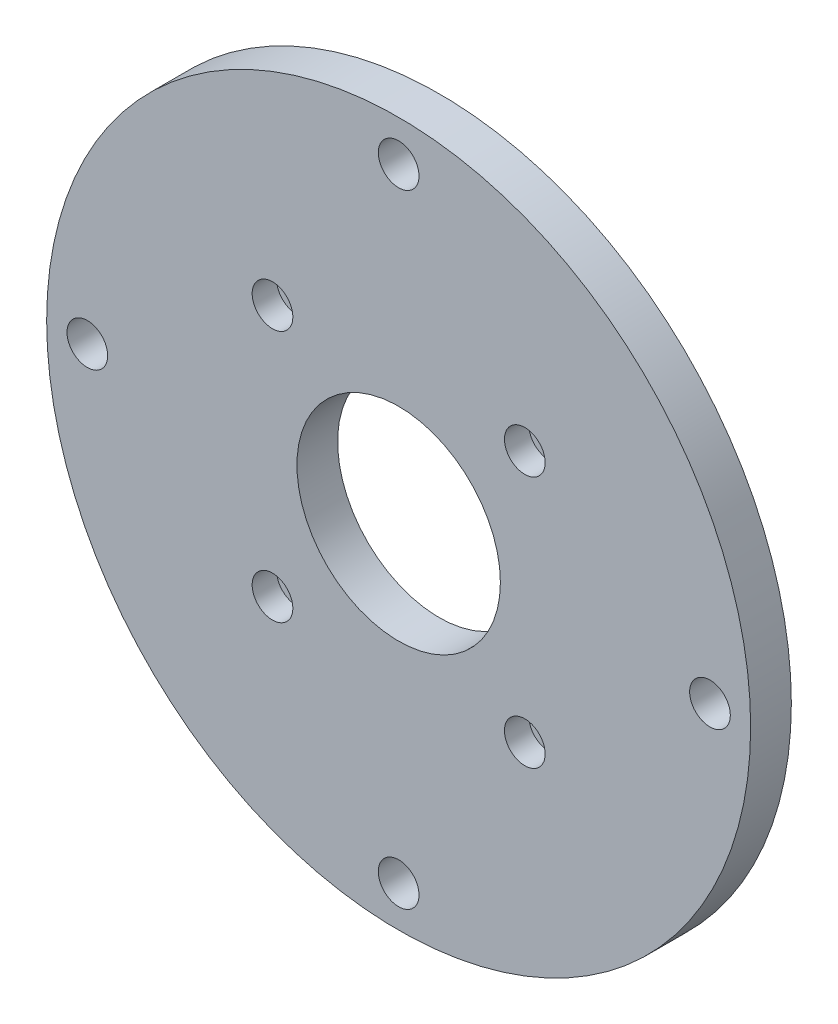
ISO-10303-21;
HEADER;
FILE_DESCRIPTION(('STEP AP214'),'2;1');
FILE_NAME('part.step','',(''),(''),'','','');
FILE_SCHEMA(('AUTOMOTIVE_DESIGN { 1 0 10303 214 1 1 1 1 }'));
ENDSEC;
DATA;
#1=APPLICATION_CONTEXT('core data for automotive mechanical design processes');
#2=APPLICATION_PROTOCOL_DEFINITION('international standard','automotive_design',2000,#1);
#3=PRODUCT_CONTEXT('',#1,'mechanical');
#4=PRODUCT('Part','Part','',(#3));
#5=PRODUCT_RELATED_PRODUCT_CATEGORY('part','',(#4));
#6=PRODUCT_DEFINITION_FORMATION('','',#4);
#7=PRODUCT_DEFINITION_CONTEXT('part definition',#1,'design');
#8=PRODUCT_DEFINITION('design','',#6,#7);
#9=PRODUCT_DEFINITION_SHAPE('','',#8);
#10=(LENGTH_UNIT() NAMED_UNIT(*) SI_UNIT(.MILLI.,.METRE.));
#11=(NAMED_UNIT(*) PLANE_ANGLE_UNIT() SI_UNIT($,.RADIAN.));
#12=(NAMED_UNIT(*) SI_UNIT($,.STERADIAN.) SOLID_ANGLE_UNIT());
#13=UNCERTAINTY_MEASURE_WITH_UNIT(LENGTH_MEASURE(1.E-05),#10,'distance_accuracy_value','');
#14=(GEOMETRIC_REPRESENTATION_CONTEXT(3) GLOBAL_UNCERTAINTY_ASSIGNED_CONTEXT((#13)) GLOBAL_UNIT_ASSIGNED_CONTEXT((#10,
#11,#12)) REPRESENTATION_CONTEXT('',''));
#15=CARTESIAN_POINT('',(0.,0.,0.));
#16=DIRECTION('',(0.,0.,1.));
#17=DIRECTION('',(1.,0.,0.));
#18=AXIS2_PLACEMENT_3D('',#15,#16,#17);
#19=CARTESIAN_POINT('',(-15.5,15.5,5.));
#20=DIRECTION('',(0.,0.,-1.));
#21=DIRECTION('',(-1.,0.,0.));
#22=AXIS2_PLACEMENT_3D('',#19,#20,#21);
#23=CYLINDRICAL_SURFACE('',#22,1.75);
#24=CARTESIAN_POINT('',(-15.5,15.5,0.));
#25=DIRECTION('',(0.,0.,1.));
#26=DIRECTION('',(1.,0.,0.));
#27=AXIS2_PLACEMENT_3D('',#24,#25,#26);
#28=CIRCLE('',#27,1.75);
#29=CARTESIAN_POINT('',(-13.75,15.5,0.));
#30=VERTEX_POINT('',#29);
#31=EDGE_CURVE('E44',#30,#30,#28,.T.);
#32=ORIENTED_EDGE('',*,*,#31,.F.);
#33=EDGE_LOOP('',(#32));
#34=FACE_BOUND('',#33,.T.);
#35=CARTESIAN_POINT('',(-15.5,15.5,2.));
#36=DIRECTION('',(0.,0.,1.));
#37=DIRECTION('',(1.,0.,0.));
#38=AXIS2_PLACEMENT_3D('',#35,#36,#37);
#39=CIRCLE('',#38,1.75);
#40=CARTESIAN_POINT('',(-13.75,15.5,2.));
#41=VERTEX_POINT('',#40);
#42=EDGE_CURVE('E35',#41,#41,#39,.T.);
#43=ORIENTED_EDGE('',*,*,#42,.T.);
#44=EDGE_LOOP('',(#43));
#45=FACE_BOUND('',#44,.T.);
#46=ADVANCED_FACE('F31',(#34,#45),#23,.F.);
#47=CARTESIAN_POINT('',(15.5,15.5,5.));
#48=DIRECTION('',(0.,0.,-1.));
#49=DIRECTION('',(-1.,0.,0.));
#50=AXIS2_PLACEMENT_3D('',#47,#48,#49);
#51=CYLINDRICAL_SURFACE('',#50,1.75);
#52=CARTESIAN_POINT('',(15.5,15.5,0.));
#53=DIRECTION('',(0.,0.,1.));
#54=DIRECTION('',(1.,0.,0.));
#55=AXIS2_PLACEMENT_3D('',#52,#53,#54);
#56=CIRCLE('',#55,1.75);
#57=CARTESIAN_POINT('',(17.25,15.5,0.));
#58=VERTEX_POINT('',#57);
#59=EDGE_CURVE('E78',#58,#58,#56,.T.);
#60=ORIENTED_EDGE('',*,*,#59,.F.);
#61=EDGE_LOOP('',(#60));
#62=FACE_BOUND('',#61,.T.);
#63=CARTESIAN_POINT('',(15.5,15.5,2.));
#64=DIRECTION('',(0.,0.,1.));
#65=DIRECTION('',(1.,0.,0.));
#66=AXIS2_PLACEMENT_3D('',#63,#64,#65);
#67=CIRCLE('',#66,1.75);
#68=CARTESIAN_POINT('',(17.25,15.5,2.));
#69=VERTEX_POINT('',#68);
#70=EDGE_CURVE('E55',#69,#69,#67,.T.);
#71=ORIENTED_EDGE('',*,*,#70,.T.);
#72=EDGE_LOOP('',(#71));
#73=FACE_BOUND('',#72,.T.);
#74=ADVANCED_FACE('F123',(#62,#73),#51,.F.);
#75=CARTESIAN_POINT('',(15.5,-15.5,5.));
#76=DIRECTION('',(0.,0.,-1.));
#77=DIRECTION('',(-1.,0.,0.));
#78=AXIS2_PLACEMENT_3D('',#75,#76,#77);
#79=CYLINDRICAL_SURFACE('',#78,1.75);
#80=CARTESIAN_POINT('',(15.5,-15.5,0.));
#81=DIRECTION('',(0.,0.,1.));
#82=DIRECTION('',(1.,0.,0.));
#83=AXIS2_PLACEMENT_3D('',#80,#81,#82);
#84=CIRCLE('',#83,1.75);
#85=CARTESIAN_POINT('',(17.25,-15.5,0.));
#86=VERTEX_POINT('',#85);
#87=EDGE_CURVE('E75',#86,#86,#84,.T.);
#88=ORIENTED_EDGE('',*,*,#87,.F.);
#89=EDGE_LOOP('',(#88));
#90=FACE_BOUND('',#89,.T.);
#91=CARTESIAN_POINT('',(15.5,-15.5,2.));
#92=DIRECTION('',(0.,0.,1.));
#93=DIRECTION('',(1.,0.,0.));
#94=AXIS2_PLACEMENT_3D('',#91,#92,#93);
#95=CIRCLE('',#94,1.75);
#96=CARTESIAN_POINT('',(17.25,-15.5,2.));
#97=VERTEX_POINT('',#96);
#98=EDGE_CURVE('E52',#97,#97,#95,.T.);
#99=ORIENTED_EDGE('',*,*,#98,.T.);
#100=EDGE_LOOP('',(#99));
#101=FACE_BOUND('',#100,.T.);
#102=ADVANCED_FACE('F128',(#90,#101),#79,.F.);
#103=CARTESIAN_POINT('',(-15.5,-15.5,5.));
#104=DIRECTION('',(0.,0.,-1.));
#105=DIRECTION('',(-1.,0.,0.));
#106=AXIS2_PLACEMENT_3D('',#103,#104,#105);
#107=CYLINDRICAL_SURFACE('',#106,1.75);
#108=CARTESIAN_POINT('',(-15.5,-15.5,0.));
#109=DIRECTION('',(0.,0.,1.));
#110=DIRECTION('',(1.,0.,0.));
#111=AXIS2_PLACEMENT_3D('',#108,#109,#110);
#112=CIRCLE('',#111,1.75);
#113=CARTESIAN_POINT('',(-13.75,-15.5,0.));
#114=VERTEX_POINT('',#113);
#115=EDGE_CURVE('E69',#114,#114,#112,.T.);
#116=ORIENTED_EDGE('',*,*,#115,.F.);
#117=EDGE_LOOP('',(#116));
#118=FACE_BOUND('',#117,.T.);
#119=CARTESIAN_POINT('',(-15.5,-15.5,2.));
#120=DIRECTION('',(0.,0.,1.));
#121=DIRECTION('',(1.,0.,0.));
#122=AXIS2_PLACEMENT_3D('',#119,#120,#121);
#123=CIRCLE('',#122,1.75);
#124=CARTESIAN_POINT('',(-13.75,-15.5,2.));
#125=VERTEX_POINT('',#124);
#126=EDGE_CURVE('E49',#125,#125,#123,.T.);
#127=ORIENTED_EDGE('',*,*,#126,.T.);
#128=EDGE_LOOP('',(#127));
#129=FACE_BOUND('',#128,.T.);
#130=ADVANCED_FACE('F135',(#118,#129),#107,.F.);
#131=CARTESIAN_POINT('',(0.,0.,5.));
#132=DIRECTION('',(0.,0.,1.));
#133=DIRECTION('',(1.,0.,0.));
#134=AXIS2_PLACEMENT_3D('',#131,#132,#133);
#135=PLANE('',#134);
#136=CARTESIAN_POINT('',(-15.5,-15.5,5.));
#137=DIRECTION('',(0.,0.,1.));
#138=DIRECTION('',(1.,0.,0.));
#139=AXIS2_PLACEMENT_3D('',#136,#137,#138);
#140=CIRCLE('',#139,2.5);
#141=CARTESIAN_POINT('',(-13.,-15.5,5.));
#142=VERTEX_POINT('',#141);
#143=EDGE_CURVE('E314',#142,#142,#140,.T.);
#144=ORIENTED_EDGE('',*,*,#143,.F.);
#145=EDGE_LOOP('',(#144));
#146=FACE_BOUND('',#145,.T.);
#147=CARTESIAN_POINT('',(15.5,-15.5,5.));
#148=DIRECTION('',(0.,0.,1.));
#149=DIRECTION('',(1.,0.,0.));
#150=AXIS2_PLACEMENT_3D('',#147,#148,#149);
#151=CIRCLE('',#150,2.5);
#152=CARTESIAN_POINT('',(18.,-15.5,5.));
#153=VERTEX_POINT('',#152);
#154=EDGE_CURVE('E320',#153,#153,#151,.T.);
#155=ORIENTED_EDGE('',*,*,#154,.F.);
#156=EDGE_LOOP('',(#155));
#157=FACE_BOUND('',#156,.T.);
#158=CARTESIAN_POINT('',(15.5,15.5,5.));
#159=DIRECTION('',(0.,0.,1.));
#160=DIRECTION('',(1.,0.,0.));
#161=AXIS2_PLACEMENT_3D('',#158,#159,#160);
#162=CIRCLE('',#161,2.5);
#163=CARTESIAN_POINT('',(18.,15.5,5.));
#164=VERTEX_POINT('',#163);
#165=EDGE_CURVE('E326',#164,#164,#162,.T.);
#166=ORIENTED_EDGE('',*,*,#165,.F.);
#167=EDGE_LOOP('',(#166));
#168=FACE_BOUND('',#167,.T.);
#169=CARTESIAN_POINT('',(-15.5,15.5,5.));
#170=DIRECTION('',(0.,0.,1.));
#171=DIRECTION('',(1.,0.,0.));
#172=AXIS2_PLACEMENT_3D('',#169,#170,#171);
#173=CIRCLE('',#172,2.5);
#174=CARTESIAN_POINT('',(-13.,15.5,5.));
#175=VERTEX_POINT('',#174);
#176=EDGE_CURVE('E309',#175,#175,#173,.T.);
#177=ORIENTED_EDGE('',*,*,#176,.F.);
#178=EDGE_LOOP('',(#177));
#179=FACE_BOUND('',#178,.T.);
#180=CARTESIAN_POINT('',(0.,-38.25,5.));
#181=DIRECTION('',(0.,0.,1.));
#182=DIRECTION('',(1.,0.,0.));
#183=AXIS2_PLACEMENT_3D('',#180,#181,#182);
#184=CIRCLE('',#183,2.5);
#185=CARTESIAN_POINT('',(2.5,-38.25,5.));
#186=VERTEX_POINT('',#185);
#187=EDGE_CURVE('E88',#186,#186,#184,.T.);
#188=ORIENTED_EDGE('',*,*,#187,.F.);
#189=EDGE_LOOP('',(#188));
#190=FACE_BOUND('',#189,.T.);
#191=CARTESIAN_POINT('',(0.,38.25,5.));
#192=DIRECTION('',(0.,0.,1.));
#193=DIRECTION('',(1.,0.,0.));
#194=AXIS2_PLACEMENT_3D('',#191,#192,#193);
#195=CIRCLE('',#194,2.5);
#196=CARTESIAN_POINT('',(2.5,38.25,5.));
#197=VERTEX_POINT('',#196);
#198=EDGE_CURVE('E100',#197,#197,#195,.T.);
#199=ORIENTED_EDGE('',*,*,#198,.F.);
#200=EDGE_LOOP('',(#199));
#201=FACE_BOUND('',#200,.T.);
#202=CARTESIAN_POINT('',(0.,0.,5.));
#203=DIRECTION('',(0.,0.,1.));
#204=DIRECTION('',(1.,0.,0.));
#205=AXIS2_PLACEMENT_3D('',#202,#203,#204);
#206=CIRCLE('',#205,43.25);
#207=CARTESIAN_POINT('',(43.25,0.,5.));
#208=VERTEX_POINT('',#207);
#209=EDGE_CURVE('E10',#208,#208,#206,.T.);
#210=ORIENTED_EDGE('',*,*,#209,.T.);
#211=EDGE_LOOP('',(#210));
#212=FACE_BOUND('',#211,.T.);
#213=CARTESIAN_POINT('',(38.25,0.,5.));
#214=DIRECTION('',(0.,0.,1.));
#215=DIRECTION('',(1.,0.,0.));
#216=AXIS2_PLACEMENT_3D('',#213,#214,#215);
#217=CIRCLE('',#216,2.5);
#218=CARTESIAN_POINT('',(40.75,0.,5.));
#219=VERTEX_POINT('',#218);
#220=EDGE_CURVE('E94',#219,#219,#217,.T.);
#221=ORIENTED_EDGE('',*,*,#220,.F.);
#222=EDGE_LOOP('',(#221));
#223=FACE_BOUND('',#222,.T.);
#224=CARTESIAN_POINT('',(-38.25,0.,5.));
#225=DIRECTION('',(0.,0.,1.));
#226=DIRECTION('',(1.,0.,0.));
#227=AXIS2_PLACEMENT_3D('',#224,#225,#226);
#228=CIRCLE('',#227,2.5);
#229=CARTESIAN_POINT('',(-35.75,0.,5.));
#230=VERTEX_POINT('',#229);
#231=EDGE_CURVE('E82',#230,#230,#228,.T.);
#232=ORIENTED_EDGE('',*,*,#231,.F.);
#233=EDGE_LOOP('',(#232));
#234=FACE_BOUND('',#233,.T.);
#235=CARTESIAN_POINT('',(0.,0.,5.));
#236=DIRECTION('',(0.,0.,1.));
#237=DIRECTION('',(1.,0.,0.));
#238=AXIS2_PLACEMENT_3D('',#235,#236,#237);
#239=CIRCLE('',#238,12.5);
#240=CARTESIAN_POINT('',(12.5,0.,5.));
#241=VERTEX_POINT('',#240);
#242=EDGE_CURVE('E64',#241,#241,#239,.T.);
#243=ORIENTED_EDGE('',*,*,#242,.F.);
#244=EDGE_LOOP('',(#243));
#245=FACE_BOUND('',#244,.T.);
#246=ADVANCED_FACE('F133',(#146,#157,#168,#179,#190,#201,#212,#223,#234,#245),#135,.T.);
#247=CARTESIAN_POINT('',(0.,0.,0.));
#248=DIRECTION('',(0.,0.,1.));
#249=DIRECTION('',(1.,0.,0.));
#250=AXIS2_PLACEMENT_3D('',#247,#248,#249);
#251=PLANE('',#250);
#252=CARTESIAN_POINT('',(0.,0.,0.));
#253=DIRECTION('',(0.,0.,1.));
#254=DIRECTION('',(1.,0.,0.));
#255=AXIS2_PLACEMENT_3D('',#252,#253,#254);
#256=CIRCLE('',#255,43.25);
#257=CARTESIAN_POINT('',(43.25,0.,0.));
#258=VERTEX_POINT('',#257);
#259=EDGE_CURVE('E39',#258,#258,#256,.T.);
#260=ORIENTED_EDGE('',*,*,#259,.F.);
#261=EDGE_LOOP('',(#260));
#262=FACE_BOUND('',#261,.T.);
#263=ORIENTED_EDGE('',*,*,#31,.T.);
#264=EDGE_LOOP('',(#263));
#265=FACE_BOUND('',#264,.T.);
#266=CARTESIAN_POINT('',(0.,38.25,0.));
#267=DIRECTION('',(0.,0.,1.));
#268=DIRECTION('',(1.,0.,0.));
#269=AXIS2_PLACEMENT_3D('',#266,#267,#268);
#270=CIRCLE('',#269,2.5);
#271=CARTESIAN_POINT('',(2.5,38.25,0.));
#272=VERTEX_POINT('',#271);
#273=EDGE_CURVE('E97',#272,#272,#270,.T.);
#274=ORIENTED_EDGE('',*,*,#273,.T.);
#275=EDGE_LOOP('',(#274));
#276=FACE_BOUND('',#275,.T.);
#277=CARTESIAN_POINT('',(38.25,0.,0.));
#278=DIRECTION('',(0.,0.,1.));
#279=DIRECTION('',(1.,0.,0.));
#280=AXIS2_PLACEMENT_3D('',#277,#278,#279);
#281=CIRCLE('',#280,2.5);
#282=CARTESIAN_POINT('',(40.75,0.,0.));
#283=VERTEX_POINT('',#282);
#284=EDGE_CURVE('E91',#283,#283,#281,.T.);
#285=ORIENTED_EDGE('',*,*,#284,.T.);
#286=EDGE_LOOP('',(#285));
#287=FACE_BOUND('',#286,.T.);
#288=CARTESIAN_POINT('',(0.,-38.25,0.));
#289=DIRECTION('',(0.,0.,1.));
#290=DIRECTION('',(1.,0.,0.));
#291=AXIS2_PLACEMENT_3D('',#288,#289,#290);
#292=CIRCLE('',#291,2.5);
#293=CARTESIAN_POINT('',(2.5,-38.25,0.));
#294=VERTEX_POINT('',#293);
#295=EDGE_CURVE('E85',#294,#294,#292,.T.);
#296=ORIENTED_EDGE('',*,*,#295,.T.);
#297=EDGE_LOOP('',(#296));
#298=FACE_BOUND('',#297,.T.);
#299=CARTESIAN_POINT('',(-38.25,0.,0.));
#300=DIRECTION('',(0.,0.,1.));
#301=DIRECTION('',(1.,0.,0.));
#302=AXIS2_PLACEMENT_3D('',#299,#300,#301);
#303=CIRCLE('',#302,2.5);
#304=CARTESIAN_POINT('',(-35.75,0.,0.));
#305=VERTEX_POINT('',#304);
#306=EDGE_CURVE('E81',#305,#305,#303,.T.);
#307=ORIENTED_EDGE('',*,*,#306,.T.);
#308=EDGE_LOOP('',(#307));
#309=FACE_BOUND('',#308,.T.);
#310=ORIENTED_EDGE('',*,*,#59,.T.);
#311=EDGE_LOOP('',(#310));
#312=FACE_BOUND('',#311,.T.);
#313=ORIENTED_EDGE('',*,*,#87,.T.);
#314=EDGE_LOOP('',(#313));
#315=FACE_BOUND('',#314,.T.);
#316=ORIENTED_EDGE('',*,*,#115,.T.);
#317=EDGE_LOOP('',(#316));
#318=FACE_BOUND('',#317,.T.);
#319=CARTESIAN_POINT('',(0.,0.,0.));
#320=DIRECTION('',(0.,0.,1.));
#321=DIRECTION('',(1.,0.,0.));
#322=AXIS2_PLACEMENT_3D('',#319,#320,#321);
#323=CIRCLE('',#322,12.5);
#324=CARTESIAN_POINT('',(12.5,0.,0.));
#325=VERTEX_POINT('',#324);
#326=EDGE_CURVE('E60',#325,#325,#323,.T.);
#327=ORIENTED_EDGE('',*,*,#326,.T.);
#328=EDGE_LOOP('',(#327));
#329=FACE_BOUND('',#328,.T.);
#330=ADVANCED_FACE('F105',(#262,#265,#276,#287,#298,#309,#312,#315,#318,#329),#251,.F.);
#331=CARTESIAN_POINT('',(0.,0.,5.));
#332=DIRECTION('',(0.,0.,-1.));
#333=DIRECTION('',(-1.,0.,0.));
#334=AXIS2_PLACEMENT_3D('',#331,#332,#333);
#335=CYLINDRICAL_SURFACE('',#334,43.25);
#336=ORIENTED_EDGE('',*,*,#209,.F.);
#337=EDGE_LOOP('',(#336));
#338=FACE_BOUND('',#337,.T.);
#339=ORIENTED_EDGE('',*,*,#259,.T.);
#340=EDGE_LOOP('',(#339));
#341=FACE_BOUND('',#340,.T.);
#342=ADVANCED_FACE('F33',(#338,#341),#335,.T.);
#343=CARTESIAN_POINT('',(0.,38.25,5.));
#344=DIRECTION('',(0.,0.,-1.));
#345=DIRECTION('',(-1.,0.,0.));
#346=AXIS2_PLACEMENT_3D('',#343,#344,#345);
#347=CYLINDRICAL_SURFACE('',#346,2.5);
#348=ORIENTED_EDGE('',*,*,#198,.T.);
#349=EDGE_LOOP('',(#348));
#350=FACE_BOUND('',#349,.T.);
#351=ORIENTED_EDGE('',*,*,#273,.F.);
#352=EDGE_LOOP('',(#351));
#353=FACE_BOUND('',#352,.T.);
#354=ADVANCED_FACE('F108',(#350,#353),#347,.F.);
#355=CARTESIAN_POINT('',(38.25,0.,5.));
#356=DIRECTION('',(0.,0.,-1.));
#357=DIRECTION('',(-1.,0.,0.));
#358=AXIS2_PLACEMENT_3D('',#355,#356,#357);
#359=CYLINDRICAL_SURFACE('',#358,2.5);
#360=ORIENTED_EDGE('',*,*,#220,.T.);
#361=EDGE_LOOP('',(#360));
#362=FACE_BOUND('',#361,.T.);
#363=ORIENTED_EDGE('',*,*,#284,.F.);
#364=EDGE_LOOP('',(#363));
#365=FACE_BOUND('',#364,.T.);
#366=ADVANCED_FACE('F110',(#362,#365),#359,.F.);
#367=CARTESIAN_POINT('',(0.,-38.25,5.));
#368=DIRECTION('',(0.,0.,-1.));
#369=DIRECTION('',(-1.,0.,0.));
#370=AXIS2_PLACEMENT_3D('',#367,#368,#369);
#371=CYLINDRICAL_SURFACE('',#370,2.5);
#372=ORIENTED_EDGE('',*,*,#187,.T.);
#373=EDGE_LOOP('',(#372));
#374=FACE_BOUND('',#373,.T.);
#375=ORIENTED_EDGE('',*,*,#295,.F.);
#376=EDGE_LOOP('',(#375));
#377=FACE_BOUND('',#376,.T.);
#378=ADVANCED_FACE('F117',(#374,#377),#371,.F.);
#379=CARTESIAN_POINT('',(-38.25,0.,5.));
#380=DIRECTION('',(0.,0.,-1.));
#381=DIRECTION('',(-1.,0.,0.));
#382=AXIS2_PLACEMENT_3D('',#379,#380,#381);
#383=CYLINDRICAL_SURFACE('',#382,2.5);
#384=ORIENTED_EDGE('',*,*,#231,.T.);
#385=EDGE_LOOP('',(#384));
#386=FACE_BOUND('',#385,.T.);
#387=ORIENTED_EDGE('',*,*,#306,.F.);
#388=EDGE_LOOP('',(#387));
#389=FACE_BOUND('',#388,.T.);
#390=ADVANCED_FACE('F171',(#386,#389),#383,.F.);
#391=CARTESIAN_POINT('',(0.,0.,5.));
#392=DIRECTION('',(0.,0.,-1.));
#393=DIRECTION('',(-1.,0.,0.));
#394=AXIS2_PLACEMENT_3D('',#391,#392,#393);
#395=CYLINDRICAL_SURFACE('',#394,12.5);
#396=ORIENTED_EDGE('',*,*,#242,.T.);
#397=EDGE_LOOP('',(#396));
#398=FACE_BOUND('',#397,.T.);
#399=ORIENTED_EDGE('',*,*,#326,.F.);
#400=EDGE_LOOP('',(#399));
#401=FACE_BOUND('',#400,.T.);
#402=ADVANCED_FACE('F181',(#398,#401),#395,.F.);
#403=CARTESIAN_POINT('',(-15.5,-15.5,2.));
#404=DIRECTION('',(0.,0.,1.));
#405=DIRECTION('',(1.,0.,0.));
#406=AXIS2_PLACEMENT_3D('',#403,#404,#405);
#407=CYLINDRICAL_SURFACE('',#406,2.5);
#408=CARTESIAN_POINT('',(-15.5,-15.5,2.));
#409=DIRECTION('',(0.,0.,1.));
#410=DIRECTION('',(1.,0.,0.));
#411=AXIS2_PLACEMENT_3D('',#408,#409,#410);
#412=CIRCLE('',#411,2.5);
#413=CARTESIAN_POINT('',(-13.,-15.5,2.));
#414=VERTEX_POINT('',#413);
#415=EDGE_CURVE('E317',#414,#414,#412,.T.);
#416=ORIENTED_EDGE('',*,*,#415,.F.);
#417=EDGE_LOOP('',(#416));
#418=FACE_BOUND('',#417,.T.);
#419=ORIENTED_EDGE('',*,*,#143,.T.);
#420=EDGE_LOOP('',(#419));
#421=FACE_BOUND('',#420,.T.);
#422=ADVANCED_FACE('F190',(#418,#421),#407,.F.);
#423=CARTESIAN_POINT('',(-15.5,-15.5,2.));
#424=DIRECTION('',(0.,0.,1.));
#425=DIRECTION('',(1.,0.,0.));
#426=AXIS2_PLACEMENT_3D('',#423,#424,#425);
#427=PLANE('',#426);
#428=ORIENTED_EDGE('',*,*,#126,.F.);
#429=EDGE_LOOP('',(#428));
#430=FACE_BOUND('',#429,.T.);
#431=ORIENTED_EDGE('',*,*,#415,.T.);
#432=EDGE_LOOP('',(#431));
#433=FACE_BOUND('',#432,.T.);
#434=ADVANCED_FACE('F232',(#430,#433),#427,.T.);
#435=CARTESIAN_POINT('',(15.5,-15.5,2.));
#436=DIRECTION('',(0.,0.,1.));
#437=DIRECTION('',(1.,0.,0.));
#438=AXIS2_PLACEMENT_3D('',#435,#436,#437);
#439=CYLINDRICAL_SURFACE('',#438,2.5);
#440=CARTESIAN_POINT('',(15.5,-15.5,2.));
#441=DIRECTION('',(0.,0.,1.));
#442=DIRECTION('',(1.,0.,0.));
#443=AXIS2_PLACEMENT_3D('',#440,#441,#442);
#444=CIRCLE('',#443,2.5);
#445=CARTESIAN_POINT('',(18.,-15.5,2.));
#446=VERTEX_POINT('',#445);
#447=EDGE_CURVE('E323',#446,#446,#444,.T.);
#448=ORIENTED_EDGE('',*,*,#447,.F.);
#449=EDGE_LOOP('',(#448));
#450=FACE_BOUND('',#449,.T.);
#451=ORIENTED_EDGE('',*,*,#154,.T.);
#452=EDGE_LOOP('',(#451));
#453=FACE_BOUND('',#452,.T.);
#454=ADVANCED_FACE('F242',(#450,#453),#439,.F.);
#455=CARTESIAN_POINT('',(15.5,-15.5,2.));
#456=DIRECTION('',(0.,0.,1.));
#457=DIRECTION('',(1.,0.,0.));
#458=AXIS2_PLACEMENT_3D('',#455,#456,#457);
#459=PLANE('',#458);
#460=ORIENTED_EDGE('',*,*,#98,.F.);
#461=EDGE_LOOP('',(#460));
#462=FACE_BOUND('',#461,.T.);
#463=ORIENTED_EDGE('',*,*,#447,.T.);
#464=EDGE_LOOP('',(#463));
#465=FACE_BOUND('',#464,.T.);
#466=ADVANCED_FACE('F252',(#462,#465),#459,.T.);
#467=CARTESIAN_POINT('',(15.5,15.5,2.));
#468=DIRECTION('',(0.,0.,1.));
#469=DIRECTION('',(1.,0.,0.));
#470=AXIS2_PLACEMENT_3D('',#467,#468,#469);
#471=CYLINDRICAL_SURFACE('',#470,2.5);
#472=CARTESIAN_POINT('',(15.5,15.5,2.));
#473=DIRECTION('',(0.,0.,1.));
#474=DIRECTION('',(1.,0.,0.));
#475=AXIS2_PLACEMENT_3D('',#472,#473,#474);
#476=CIRCLE('',#475,2.5);
#477=CARTESIAN_POINT('',(18.,15.5,2.));
#478=VERTEX_POINT('',#477);
#479=EDGE_CURVE('E312',#478,#478,#476,.T.);
#480=ORIENTED_EDGE('',*,*,#479,.F.);
#481=EDGE_LOOP('',(#480));
#482=FACE_BOUND('',#481,.T.);
#483=ORIENTED_EDGE('',*,*,#165,.T.);
#484=EDGE_LOOP('',(#483));
#485=FACE_BOUND('',#484,.T.);
#486=ADVANCED_FACE('F262',(#482,#485),#471,.F.);
#487=CARTESIAN_POINT('',(15.5,15.5,2.));
#488=DIRECTION('',(0.,0.,1.));
#489=DIRECTION('',(1.,0.,0.));
#490=AXIS2_PLACEMENT_3D('',#487,#488,#489);
#491=PLANE('',#490);
#492=ORIENTED_EDGE('',*,*,#70,.F.);
#493=EDGE_LOOP('',(#492));
#494=FACE_BOUND('',#493,.T.);
#495=ORIENTED_EDGE('',*,*,#479,.T.);
#496=EDGE_LOOP('',(#495));
#497=FACE_BOUND('',#496,.T.);
#498=ADVANCED_FACE('F272',(#494,#497),#491,.T.);
#499=CARTESIAN_POINT('',(-15.5,15.5,2.));
#500=DIRECTION('',(0.,0.,1.));
#501=DIRECTION('',(1.,0.,0.));
#502=AXIS2_PLACEMENT_3D('',#499,#500,#501);
#503=CYLINDRICAL_SURFACE('',#502,2.5);
#504=CARTESIAN_POINT('',(-15.5,15.5,2.));
#505=DIRECTION('',(0.,0.,1.));
#506=DIRECTION('',(1.,0.,0.));
#507=AXIS2_PLACEMENT_3D('',#504,#505,#506);
#508=CIRCLE('',#507,2.5);
#509=CARTESIAN_POINT('',(-13.,15.5,2.));
#510=VERTEX_POINT('',#509);
#511=EDGE_CURVE('E53',#510,#510,#508,.T.);
#512=ORIENTED_EDGE('',*,*,#511,.F.);
#513=EDGE_LOOP('',(#512));
#514=FACE_BOUND('',#513,.T.);
#515=ORIENTED_EDGE('',*,*,#176,.T.);
#516=EDGE_LOOP('',(#515));
#517=FACE_BOUND('',#516,.T.);
#518=ADVANCED_FACE('F282',(#514,#517),#503,.F.);
#519=CARTESIAN_POINT('',(-15.5,15.5,2.));
#520=DIRECTION('',(0.,0.,1.));
#521=DIRECTION('',(1.,0.,0.));
#522=AXIS2_PLACEMENT_3D('',#519,#520,#521);
#523=PLANE('',#522);
#524=ORIENTED_EDGE('',*,*,#42,.F.);
#525=EDGE_LOOP('',(#524));
#526=FACE_BOUND('',#525,.T.);
#527=ORIENTED_EDGE('',*,*,#511,.T.);
#528=EDGE_LOOP('',(#527));
#529=FACE_BOUND('',#528,.T.);
#530=ADVANCED_FACE('F292',(#526,#529),#523,.T.);
#531=CLOSED_SHELL('',(#46,#74,#102,#130,#246,#330,#342,#354,#366,#378,#390,#402,#422,#434,#454,
#466,#486,#498,#518,#530));
#532=MANIFOLD_SOLID_BREP('B2',#531);
#533=ADVANCED_BREP_SHAPE_REPRESENTATION('',(#18,#532),#14);
#534=SHAPE_DEFINITION_REPRESENTATION(#9,#533);
ENDSEC;
END-ISO-10303-21;
